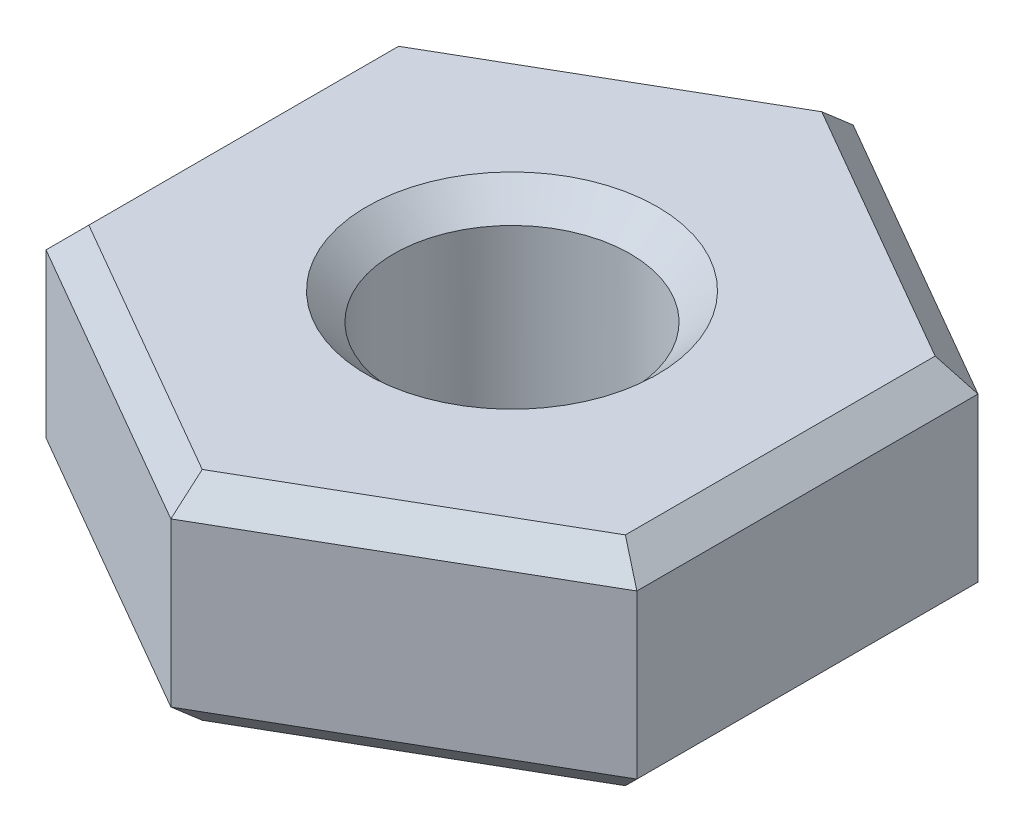
ISO-10303-21;
HEADER;
FILE_DESCRIPTION(('STEP AP214'),'2;1');
FILE_NAME('part.step','',(''),(''),'','','');
FILE_SCHEMA(('AUTOMOTIVE_DESIGN { 1 0 10303 214 1 1 1 1 }'));
ENDSEC;
DATA;
#1=APPLICATION_CONTEXT('core data for automotive mechanical design processes');
#2=APPLICATION_PROTOCOL_DEFINITION('international standard','automotive_design',2000,#1);
#3=PRODUCT_CONTEXT('',#1,'mechanical');
#4=PRODUCT('Part','Part','',(#3));
#5=PRODUCT_RELATED_PRODUCT_CATEGORY('part','',(#4));
#6=PRODUCT_DEFINITION_FORMATION('','',#4);
#7=PRODUCT_DEFINITION_CONTEXT('part definition',#1,'design');
#8=PRODUCT_DEFINITION('design','',#6,#7);
#9=PRODUCT_DEFINITION_SHAPE('','',#8);
#10=(LENGTH_UNIT() NAMED_UNIT(*) SI_UNIT(.MILLI.,.METRE.));
#11=(NAMED_UNIT(*) PLANE_ANGLE_UNIT() SI_UNIT($,.RADIAN.));
#12=(NAMED_UNIT(*) SI_UNIT($,.STERADIAN.) SOLID_ANGLE_UNIT());
#13=UNCERTAINTY_MEASURE_WITH_UNIT(LENGTH_MEASURE(1.E-05),#10,'distance_accuracy_value','');
#14=(GEOMETRIC_REPRESENTATION_CONTEXT(3) GLOBAL_UNCERTAINTY_ASSIGNED_CONTEXT((#13)) GLOBAL_UNIT_ASSIGNED_CONTEXT((#10,
#11,#12)) REPRESENTATION_CONTEXT('',''));
#15=CARTESIAN_POINT('',(0.,0.,0.));
#16=DIRECTION('',(0.,0.,1.));
#17=DIRECTION('',(1.,0.,0.));
#18=AXIS2_PLACEMENT_3D('',#15,#16,#17);
#19=CARTESIAN_POINT('',(4.318,3.175,-2.4929984623608));
#20=DIRECTION('',(-0.500000000000001,0.,0.866025403784438));
#21=DIRECTION('',(0.866025403784438,0.,0.500000000000001));
#22=AXIS2_PLACEMENT_3D('',#19,#20,#21);
#23=PLANE('',#22);
#24=DIRECTION('',(0.,-1.,0.));
#25=VECTOR('',#24,1.);
#26=CARTESIAN_POINT('',(4.318,3.175,-2.4929984623608));
#27=LINE('',#26,#25);
#28=CARTESIAN_POINT('',(4.318,2.778125,-2.4929984623608));
#29=VERTEX_POINT('',#28);
#30=CARTESIAN_POINT('',(4.318,0.396875000000002,-2.4929984623608));
#31=VERTEX_POINT('',#30);
#32=EDGE_CURVE('E110',#29,#31,#27,.T.);
#33=ORIENTED_EDGE('',*,*,#32,.T.);
#34=DIRECTION('',(-0.866025403784438,0.,-0.500000000000001));
#35=VECTOR('',#34,1.);
#36=CARTESIAN_POINT('',(0.,0.396875000000002,-4.98599692472161));
#37=LINE('',#36,#35);
#38=CARTESIAN_POINT('',(0.,0.396875000000001,-4.98599692472161));
#39=VERTEX_POINT('',#38);
#40=EDGE_CURVE('E117',#31,#39,#37,.T.);
#41=ORIENTED_EDGE('',*,*,#40,.T.);
#42=DIRECTION('',(0.,-1.,0.));
#43=VECTOR('',#42,1.);
#44=CARTESIAN_POINT('',(0.,3.175,-4.98599692472161));
#45=LINE('',#44,#43);
#46=CARTESIAN_POINT('',(0.,2.778125,-4.98599692472161));
#47=VERTEX_POINT('',#46);
#48=EDGE_CURVE('E112',#47,#39,#45,.T.);
#49=ORIENTED_EDGE('',*,*,#48,.F.);
#50=DIRECTION('',(0.866025403784438,0.,0.500000000000001));
#51=VECTOR('',#50,1.);
#52=CARTESIAN_POINT('',(4.318,2.778125,-2.4929984623608));
#53=LINE('',#52,#51);
#54=EDGE_CURVE('E108',#47,#29,#53,.T.);
#55=ORIENTED_EDGE('',*,*,#54,.T.);
#56=EDGE_LOOP('',(#33,#41,#49,#55));
#57=FACE_BOUND('',#56,.T.);
#58=ADVANCED_FACE('F14',(#57),#23,.F.);
#59=CARTESIAN_POINT('',(0.,3.175,-4.98599692472161));
#60=DIRECTION('',(0.499999999999999,0.,0.866025403784439));
#61=DIRECTION('',(0.866025403784439,0.,-0.499999999999999));
#62=AXIS2_PLACEMENT_3D('',#59,#60,#61);
#63=PLANE('',#62);
#64=ORIENTED_EDGE('',*,*,#48,.T.);
#65=DIRECTION('',(-0.866025403784439,0.,0.499999999999999));
#66=VECTOR('',#65,1.);
#67=CARTESIAN_POINT('',(-4.318,0.396875000000001,-2.49299846236081));
#68=LINE('',#67,#66);
#69=CARTESIAN_POINT('',(-4.318,0.396875000000001,-2.49299846236081));
#70=VERTEX_POINT('',#69);
#71=EDGE_CURVE('E164',#39,#70,#68,.T.);
#72=ORIENTED_EDGE('',*,*,#71,.T.);
#73=DIRECTION('',(0.,-1.,0.));
#74=VECTOR('',#73,1.);
#75=CARTESIAN_POINT('',(-4.318,3.175,-2.49299846236081));
#76=LINE('',#75,#74);
#77=CARTESIAN_POINT('',(-4.318,2.778125,-2.49299846236081));
#78=VERTEX_POINT('',#77);
#79=EDGE_CURVE('E146',#78,#70,#76,.T.);
#80=ORIENTED_EDGE('',*,*,#79,.F.);
#81=DIRECTION('',(0.866025403784439,0.,-0.499999999999999));
#82=VECTOR('',#81,1.);
#83=CARTESIAN_POINT('',(0.,2.778125,-4.98599692472161));
#84=LINE('',#83,#82);
#85=EDGE_CURVE('E162',#78,#47,#84,.T.);
#86=ORIENTED_EDGE('',*,*,#85,.T.);
#87=EDGE_LOOP('',(#64,#72,#80,#86));
#88=FACE_BOUND('',#87,.T.);
#89=ADVANCED_FACE('F224',(#88),#63,.F.);
#90=CARTESIAN_POINT('',(-4.318,3.175,-2.49299846236081));
#91=DIRECTION('',(1.,0.,0.));
#92=DIRECTION('',(0.,0.,-1.));
#93=AXIS2_PLACEMENT_3D('',#90,#91,#92);
#94=PLANE('',#93);
#95=ORIENTED_EDGE('',*,*,#79,.T.);
#96=DIRECTION('',(0.,0.,1.));
#97=VECTOR('',#96,1.);
#98=CARTESIAN_POINT('',(-4.318,0.396875000000001,2.4929984623608));
#99=LINE('',#98,#97);
#100=CARTESIAN_POINT('',(-4.318,0.396875000000001,2.4929984623608));
#101=VERTEX_POINT('',#100);
#102=EDGE_CURVE('E168',#70,#101,#99,.T.);
#103=ORIENTED_EDGE('',*,*,#102,.T.);
#104=DIRECTION('',(0.,-1.,0.));
#105=VECTOR('',#104,1.);
#106=CARTESIAN_POINT('',(-4.318,3.175,2.4929984623608));
#107=LINE('',#106,#105);
#108=CARTESIAN_POINT('',(-4.318,2.778125,2.4929984623608));
#109=VERTEX_POINT('',#108);
#110=EDGE_CURVE('E229',#109,#101,#107,.T.);
#111=ORIENTED_EDGE('',*,*,#110,.F.);
#112=DIRECTION('',(0.,0.,-1.));
#113=VECTOR('',#112,1.);
#114=CARTESIAN_POINT('',(-4.318,2.778125,-2.49299846236081));
#115=LINE('',#114,#113);
#116=EDGE_CURVE('E166',#109,#78,#115,.T.);
#117=ORIENTED_EDGE('',*,*,#116,.T.);
#118=EDGE_LOOP('',(#95,#103,#111,#117));
#119=FACE_BOUND('',#118,.T.);
#120=ADVANCED_FACE('F264',(#119),#94,.F.);
#121=CARTESIAN_POINT('',(-4.318,3.175,2.4929984623608));
#122=DIRECTION('',(0.5,0.,-0.866025403784438));
#123=DIRECTION('',(-0.866025403784438,0.,-0.5));
#124=AXIS2_PLACEMENT_3D('',#121,#122,#123);
#125=PLANE('',#124);
#126=ORIENTED_EDGE('',*,*,#110,.T.);
#127=DIRECTION('',(0.866025403784438,0.,0.5));
#128=VECTOR('',#127,1.);
#129=CARTESIAN_POINT('',(0.,0.396875000000001,4.98599692472161));
#130=LINE('',#129,#128);
#131=CARTESIAN_POINT('',(0.,0.396875000000002,4.98599692472161));
#132=VERTEX_POINT('',#131);
#133=EDGE_CURVE('E173',#101,#132,#130,.T.);
#134=ORIENTED_EDGE('',*,*,#133,.T.);
#135=DIRECTION('',(0.,-1.,0.));
#136=VECTOR('',#135,1.);
#137=CARTESIAN_POINT('',(0.,3.175,4.98599692472161));
#138=LINE('',#137,#136);
#139=CARTESIAN_POINT('',(0.,2.778125,4.98599692472161));
#140=VERTEX_POINT('',#139);
#141=EDGE_CURVE('E231',#140,#132,#138,.T.);
#142=ORIENTED_EDGE('',*,*,#141,.F.);
#143=DIRECTION('',(-0.866025403784438,0.,-0.5));
#144=VECTOR('',#143,1.);
#145=CARTESIAN_POINT('',(-4.318,2.778125,2.4929984623608));
#146=LINE('',#145,#144);
#147=EDGE_CURVE('E170',#140,#109,#146,.T.);
#148=ORIENTED_EDGE('',*,*,#147,.T.);
#149=EDGE_LOOP('',(#126,#134,#142,#148));
#150=FACE_BOUND('',#149,.T.);
#151=ADVANCED_FACE('F388',(#150),#125,.F.);
#152=CARTESIAN_POINT('',(0.,3.175,4.98599692472161));
#153=DIRECTION('',(-0.5,0.,-0.866025403784439));
#154=DIRECTION('',(-0.866025403784439,0.,0.5));
#155=AXIS2_PLACEMENT_3D('',#152,#153,#154);
#156=PLANE('',#155);
#157=ORIENTED_EDGE('',*,*,#141,.T.);
#158=DIRECTION('',(0.866025403784439,0.,-0.5));
#159=VECTOR('',#158,1.);
#160=CARTESIAN_POINT('',(4.318,0.396875000000002,2.49299846236081));
#161=LINE('',#160,#159);
#162=CARTESIAN_POINT('',(4.318,0.396875000000002,2.49299846236081));
#163=VERTEX_POINT('',#162);
#164=EDGE_CURVE('E177',#132,#163,#161,.T.);
#165=ORIENTED_EDGE('',*,*,#164,.T.);
#166=DIRECTION('',(0.,-1.,0.));
#167=VECTOR('',#166,1.);
#168=CARTESIAN_POINT('',(4.318,3.175,2.49299846236081));
#169=LINE('',#168,#167);
#170=CARTESIAN_POINT('',(4.318,2.778125,2.49299846236081));
#171=VERTEX_POINT('',#170);
#172=EDGE_CURVE('E129',#171,#163,#169,.T.);
#173=ORIENTED_EDGE('',*,*,#172,.F.);
#174=DIRECTION('',(-0.866025403784439,0.,0.5));
#175=VECTOR('',#174,1.);
#176=CARTESIAN_POINT('',(0.,2.778125,4.98599692472161));
#177=LINE('',#176,#175);
#178=EDGE_CURVE('E175',#171,#140,#177,.T.);
#179=ORIENTED_EDGE('',*,*,#178,.T.);
#180=EDGE_LOOP('',(#157,#165,#173,#179));
#181=FACE_BOUND('',#180,.T.);
#182=ADVANCED_FACE('F379',(#181),#156,.F.);
#183=CARTESIAN_POINT('',(4.318,3.175,2.49299846236081));
#184=DIRECTION('',(-1.,0.,0.));
#185=DIRECTION('',(0.,0.,1.));
#186=AXIS2_PLACEMENT_3D('',#183,#184,#185);
#187=PLANE('',#186);
#188=ORIENTED_EDGE('',*,*,#172,.T.);
#189=DIRECTION('',(0.,0.,-1.));
#190=VECTOR('',#189,1.);
#191=CARTESIAN_POINT('',(4.318,0.396875000000001,-2.4929984623608));
#192=LINE('',#191,#190);
#193=EDGE_CURVE('E128',#163,#31,#192,.T.);
#194=ORIENTED_EDGE('',*,*,#193,.T.);
#195=ORIENTED_EDGE('',*,*,#32,.F.);
#196=DIRECTION('',(0.,0.,1.));
#197=VECTOR('',#196,1.);
#198=CARTESIAN_POINT('',(4.318,2.778125,2.49299846236081));
#199=LINE('',#198,#197);
#200=EDGE_CURVE('E125',#29,#171,#199,.T.);
#201=ORIENTED_EDGE('',*,*,#200,.T.);
#202=EDGE_LOOP('',(#188,#194,#195,#201));
#203=FACE_BOUND('',#202,.T.);
#204=ADVANCED_FACE('F123',(#203),#187,.F.);
#205=CARTESIAN_POINT('',(8.636,3.175,0.));
#206=DIRECTION('',(0.,-1.,0.));
#207=DIRECTION('',(0.,0.,-1.));
#208=AXIS2_PLACEMENT_3D('',#205,#206,#207);
#209=PLANE('',#208);
#210=CARTESIAN_POINT('',(0.,3.175,0.));
#211=DIRECTION('',(0.,-1.,0.));
#212=DIRECTION('',(0.,0.,-1.));
#213=AXIS2_PLACEMENT_3D('',#210,#211,#212);
#214=CIRCLE('',#213,2.12407499999999);
#215=CARTESIAN_POINT('',(0.,3.175,-2.12407499999999));
#216=VERTEX_POINT('',#215);
#217=EDGE_CURVE('E9',#216,#216,#214,.T.);
#218=ORIENTED_EDGE('',*,*,#217,.T.);
#219=EDGE_LOOP('',(#218));
#220=FACE_BOUND('',#219,.T.);
#221=DIRECTION('',(0.,0.,1.));
#222=VECTOR('',#221,1.);
#223=CARTESIAN_POINT('',(-3.921125,3.175,0.));
#224=LINE('',#223,#222);
#225=CARTESIAN_POINT('',(-3.921125,3.175,-2.26386257427618));
#226=VERTEX_POINT('',#225);
#227=CARTESIAN_POINT('',(-3.921125,3.175,2.26386257427617));
#228=VERTEX_POINT('',#227);
#229=EDGE_CURVE('E182',#226,#228,#224,.T.);
#230=ORIENTED_EDGE('',*,*,#229,.T.);
#231=DIRECTION('',(0.866025403784438,0.,0.5));
#232=VECTOR('',#231,1.);
#233=CARTESIAN_POINT('',(4.5164375,3.175,7.13529155495547));
#234=LINE('',#233,#232);
#235=CARTESIAN_POINT('',(0.,3.175,4.52772514855234));
#236=VERTEX_POINT('',#235);
#237=EDGE_CURVE('E23',#228,#236,#234,.T.);
#238=ORIENTED_EDGE('',*,*,#237,.T.);
#239=DIRECTION('',(0.866025403784439,0.,-0.5));
#240=VECTOR('',#239,1.);
#241=CARTESIAN_POINT('',(8.4375625,3.175,-0.343703832126945));
#242=LINE('',#241,#240);
#243=CARTESIAN_POINT('',(3.921125,3.175,2.26386257427618));
#244=VERTEX_POINT('',#243);
#245=EDGE_CURVE('E38',#236,#244,#242,.T.);
#246=ORIENTED_EDGE('',*,*,#245,.T.);
#247=DIRECTION('',(0.,0.,-1.));
#248=VECTOR('',#247,1.);
#249=CARTESIAN_POINT('',(3.921125,3.175,0.));
#250=LINE('',#249,#248);
#251=CARTESIAN_POINT('',(3.921125,3.175,-2.26386257427617));
#252=VERTEX_POINT('',#251);
#253=EDGE_CURVE('E187',#244,#252,#250,.T.);
#254=ORIENTED_EDGE('',*,*,#253,.T.);
#255=DIRECTION('',(-0.866025403784438,0.,-0.500000000000001));
#256=VECTOR('',#255,1.);
#257=CARTESIAN_POINT('',(8.4375625,3.175,0.343703832126955));
#258=LINE('',#257,#256);
#259=CARTESIAN_POINT('',(0.,3.175,-4.52772514855234));
#260=VERTEX_POINT('',#259);
#261=EDGE_CURVE('E135',#252,#260,#258,.T.);
#262=ORIENTED_EDGE('',*,*,#261,.T.);
#263=DIRECTION('',(-0.866025403784439,0.,0.499999999999999));
#264=VECTOR('',#263,1.);
#265=CARTESIAN_POINT('',(4.51643750000001,3.175,-7.13529155495546));
#266=LINE('',#265,#264);
#267=EDGE_CURVE('E184',#260,#226,#266,.T.);
#268=ORIENTED_EDGE('',*,*,#267,.T.);
#269=EDGE_LOOP('',(#230,#238,#246,#254,#262,#268));
#270=FACE_BOUND('',#269,.T.);
#271=ADVANCED_FACE('F255',(#220,#270),#209,.F.);
#272=CARTESIAN_POINT('',(8.636,0.,0.));
#273=DIRECTION('',(0.,-1.,0.));
#274=DIRECTION('',(0.,0.,-1.));
#275=AXIS2_PLACEMENT_3D('',#272,#273,#274);
#276=PLANE('',#275);
#277=DIRECTION('',(0.866025403784438,0.,0.500000000000001));
#278=VECTOR('',#277,1.);
#279=CARTESIAN_POINT('',(4.1195625,0.,-2.14929463023385));
#280=LINE('',#279,#278);
#281=CARTESIAN_POINT('',(0.,0.,-4.52772514855234));
#282=VERTEX_POINT('',#281);
#283=CARTESIAN_POINT('',(3.921125,0.,-2.26386257427617));
#284=VERTEX_POINT('',#283);
#285=EDGE_CURVE('E157',#282,#284,#280,.T.);
#286=ORIENTED_EDGE('',*,*,#285,.T.);
#287=DIRECTION('',(0.,0.,1.));
#288=VECTOR('',#287,1.);
#289=CARTESIAN_POINT('',(3.921125,0.,2.49299846236081));
#290=LINE('',#289,#288);
#291=CARTESIAN_POINT('',(3.921125,0.,2.26386257427617));
#292=VERTEX_POINT('',#291);
#293=EDGE_CURVE('E118',#284,#292,#290,.T.);
#294=ORIENTED_EDGE('',*,*,#293,.T.);
#295=DIRECTION('',(-0.866025403784439,0.,0.5));
#296=VECTOR('',#295,1.);
#297=CARTESIAN_POINT('',(-0.198437500000001,0.,4.64229309259466));
#298=LINE('',#297,#296);
#299=CARTESIAN_POINT('',(0.,0.,4.52772514855234));
#300=VERTEX_POINT('',#299);
#301=EDGE_CURVE('E144',#292,#300,#298,.T.);
#302=ORIENTED_EDGE('',*,*,#301,.T.);
#303=DIRECTION('',(-0.866025403784438,0.,-0.5));
#304=VECTOR('',#303,1.);
#305=CARTESIAN_POINT('',(-4.1195625,0.,2.14929463023385));
#306=LINE('',#305,#304);
#307=CARTESIAN_POINT('',(-3.921125,0.,2.26386257427617));
#308=VERTEX_POINT('',#307);
#309=EDGE_CURVE('E151',#300,#308,#306,.T.);
#310=ORIENTED_EDGE('',*,*,#309,.T.);
#311=DIRECTION('',(0.,0.,-1.));
#312=VECTOR('',#311,1.);
#313=CARTESIAN_POINT('',(-3.921125,0.,-2.49299846236081));
#314=LINE('',#313,#312);
#315=CARTESIAN_POINT('',(-3.921125,0.,-2.26386257427618));
#316=VERTEX_POINT('',#315);
#317=EDGE_CURVE('E153',#308,#316,#314,.T.);
#318=ORIENTED_EDGE('',*,*,#317,.T.);
#319=DIRECTION('',(0.866025403784439,0.,-0.499999999999999));
#320=VECTOR('',#319,1.);
#321=CARTESIAN_POINT('',(0.198437500000003,0.,-4.64229309259466));
#322=LINE('',#321,#320);
#323=EDGE_CURVE('E155',#316,#282,#322,.T.);
#324=ORIENTED_EDGE('',*,*,#323,.T.);
#325=EDGE_LOOP('',(#286,#294,#302,#310,#318,#324));
#326=FACE_BOUND('',#325,.T.);
#327=CARTESIAN_POINT('',(0.,0.,0.));
#328=DIRECTION('',(0.,1.,0.));
#329=DIRECTION('',(0.,0.,1.));
#330=AXIS2_PLACEMENT_3D('',#327,#328,#329);
#331=CIRCLE('',#330,1.7272);
#332=CARTESIAN_POINT('',(0.,0.,1.7272));
#333=VERTEX_POINT('',#332);
#334=EDGE_CURVE('E130',#333,#333,#331,.T.);
#335=ORIENTED_EDGE('',*,*,#334,.T.);
#336=EDGE_LOOP('',(#335));
#337=FACE_BOUND('',#336,.T.);
#338=ADVANCED_FACE('F240',(#326,#337),#276,.T.);
#339=CARTESIAN_POINT('',(0.,3.175,0.));
#340=DIRECTION('',(0.,1.,0.));
#341=DIRECTION('',(0.,0.,1.));
#342=AXIS2_PLACEMENT_3D('',#339,#340,#341);
#343=CYLINDRICAL_SURFACE('',#342,1.72719999999999);
#344=CARTESIAN_POINT('',(0.,2.77812500000001,0.));
#345=DIRECTION('',(0.,-1.,0.));
#346=DIRECTION('',(0.,0.,-1.));
#347=AXIS2_PLACEMENT_3D('',#344,#345,#346);
#348=CIRCLE('',#347,1.72719999999999);
#349=CARTESIAN_POINT('',(0.,2.77812500000001,-1.72719999999999));
#350=VERTEX_POINT('',#349);
#351=EDGE_CURVE('E179',#350,#350,#348,.F.);
#352=ORIENTED_EDGE('',*,*,#351,.T.);
#353=EDGE_LOOP('',(#352));
#354=FACE_BOUND('',#353,.T.);
#355=ORIENTED_EDGE('',*,*,#334,.F.);
#356=EDGE_LOOP('',(#355));
#357=FACE_BOUND('',#356,.T.);
#358=ADVANCED_FACE('F242',(#354,#357),#343,.F.);
#359=CARTESIAN_POINT('',(-4.318,0.396875000000001,-2.49299846236081));
#360=DIRECTION('',(-0.707106781186547,-0.707106781186548,0.));
#361=DIRECTION('',(0.,0.,-1.));
#362=AXIS2_PLACEMENT_3D('',#359,#360,#361);
#363=PLANE('',#362);
#364=DIRECTION('',(0.654653670707978,-0.654653670707977,0.377964473009225));
#365=VECTOR('',#364,1.);
#366=CARTESIAN_POINT('',(-4.318,0.396875000000001,-2.49299846236081));
#367=LINE('',#366,#365);
#368=EDGE_CURVE('E201',#316,#70,#367,.F.);
#369=ORIENTED_EDGE('',*,*,#368,.F.);
#370=ORIENTED_EDGE('',*,*,#317,.F.);
#371=DIRECTION('',(0.654653670707977,-0.654653670707976,-0.377964473009229));
#372=VECTOR('',#371,1.);
#373=CARTESIAN_POINT('',(-4.318,0.396875000000001,2.4929984623608));
#374=LINE('',#373,#372);
#375=EDGE_CURVE('E204',#101,#308,#374,.T.);
#376=ORIENTED_EDGE('',*,*,#375,.F.);
#377=ORIENTED_EDGE('',*,*,#102,.F.);
#378=EDGE_LOOP('',(#369,#370,#376,#377));
#379=FACE_BOUND('',#378,.T.);
#380=ADVANCED_FACE('F244',(#379),#363,.T.);
#381=CARTESIAN_POINT('',(-4.318,0.396875000000001,2.4929984623608));
#382=DIRECTION('',(-0.353553390593273,-0.707106781186549,0.612372435695793));
#383=DIRECTION('',(-0.866025403784438,0.,-0.5));
#384=AXIS2_PLACEMENT_3D('',#381,#382,#383);
#385=PLANE('',#384);
#386=ORIENTED_EDGE('',*,*,#375,.T.);
#387=ORIENTED_EDGE('',*,*,#309,.F.);
#388=DIRECTION('',(0.,-0.654653670707975,-0.755928946018456));
#389=VECTOR('',#388,1.);
#390=CARTESIAN_POINT('',(0.,0.396875000000001,4.98599692472161));
#391=LINE('',#390,#389);
#392=EDGE_CURVE('E198',#132,#300,#391,.T.);
#393=ORIENTED_EDGE('',*,*,#392,.F.);
#394=ORIENTED_EDGE('',*,*,#133,.F.);
#395=EDGE_LOOP('',(#386,#387,#393,#394));
#396=FACE_BOUND('',#395,.T.);
#397=ADVANCED_FACE('F252',(#396),#385,.T.);
#398=CARTESIAN_POINT('',(0.,0.396875000000001,-4.98599692472161));
#399=DIRECTION('',(-0.353553390593274,-0.707106781186547,-0.612372435695796));
#400=DIRECTION('',(0.866025403784439,0.,-0.499999999999999));
#401=AXIS2_PLACEMENT_3D('',#398,#399,#400);
#402=PLANE('',#401);
#403=ORIENTED_EDGE('',*,*,#368,.T.);
#404=ORIENTED_EDGE('',*,*,#71,.F.);
#405=DIRECTION('',(0.,-0.654653670707977,0.755928946018454));
#406=VECTOR('',#405,1.);
#407=CARTESIAN_POINT('',(0.,0.396875000000001,-4.98599692472161));
#408=LINE('',#407,#406);
#409=EDGE_CURVE('E195',#282,#39,#408,.F.);
#410=ORIENTED_EDGE('',*,*,#409,.F.);
#411=ORIENTED_EDGE('',*,*,#323,.F.);
#412=EDGE_LOOP('',(#403,#404,#410,#411));
#413=FACE_BOUND('',#412,.T.);
#414=ADVANCED_FACE('F280',(#413),#402,.T.);
#415=CARTESIAN_POINT('',(0.,0.396875000000001,4.98599692472161));
#416=DIRECTION('',(0.353553390593272,-0.70710678118655,0.612372435695793));
#417=DIRECTION('',(-0.866025403784439,0.,0.5));
#418=AXIS2_PLACEMENT_3D('',#415,#416,#417);
#419=PLANE('',#418);
#420=ORIENTED_EDGE('',*,*,#392,.T.);
#421=ORIENTED_EDGE('',*,*,#301,.F.);
#422=DIRECTION('',(0.654653670707977,0.654653670707975,0.37796447300923));
#423=VECTOR('',#422,1.);
#424=CARTESIAN_POINT('',(3.08428571428572,-0.836839285714276,1.78071318740058));
#425=LINE('',#424,#423);
#426=EDGE_CURVE('E193',#163,#292,#425,.F.);
#427=ORIENTED_EDGE('',*,*,#426,.F.);
#428=ORIENTED_EDGE('',*,*,#164,.F.);
#429=EDGE_LOOP('',(#420,#421,#427,#428));
#430=FACE_BOUND('',#429,.T.);
#431=ADVANCED_FACE('F276',(#430),#419,.T.);
#432=CARTESIAN_POINT('',(4.318,0.396875000000001,-2.4929984623608));
#433=DIRECTION('',(0.353553390593274,-0.707106781186549,-0.612372435695793));
#434=DIRECTION('',(0.866025403784438,0.,0.500000000000001));
#435=AXIS2_PLACEMENT_3D('',#432,#433,#434);
#436=PLANE('',#435);
#437=ORIENTED_EDGE('',*,*,#409,.T.);
#438=ORIENTED_EDGE('',*,*,#40,.F.);
#439=DIRECTION('',(-0.654653670707978,-0.654653670707976,0.377964473009227));
#440=VECTOR('',#439,1.);
#441=CARTESIAN_POINT('',(4.318,0.396875000000001,-2.4929984623608));
#442=LINE('',#441,#440);
#443=EDGE_CURVE('E191',#284,#31,#442,.F.);
#444=ORIENTED_EDGE('',*,*,#443,.F.);
#445=ORIENTED_EDGE('',*,*,#285,.F.);
#446=EDGE_LOOP('',(#437,#438,#444,#445));
#447=FACE_BOUND('',#446,.T.);
#448=ADVANCED_FACE('F272',(#447),#436,.T.);
#449=CARTESIAN_POINT('',(4.318,0.396875000000001,2.49299846236081));
#450=DIRECTION('',(0.707106781186546,-0.707106781186549,0.));
#451=DIRECTION('',(0.,0.,1.));
#452=AXIS2_PLACEMENT_3D('',#449,#450,#451);
#453=PLANE('',#452);
#454=ORIENTED_EDGE('',*,*,#426,.T.);
#455=ORIENTED_EDGE('',*,*,#293,.F.);
#456=ORIENTED_EDGE('',*,*,#443,.T.);
#457=ORIENTED_EDGE('',*,*,#193,.F.);
#458=EDGE_LOOP('',(#454,#455,#456,#457));
#459=FACE_BOUND('',#458,.T.);
#460=ADVANCED_FACE('F268',(#459),#453,.T.);
#461=CARTESIAN_POINT('',(0.,2.77812500000001,0.));
#462=DIRECTION('',(0.,1.,0.));
#463=DIRECTION('',(0.,0.,1.));
#464=AXIS2_PLACEMENT_3D('',#461,#462,#463);
#465=CONICAL_SURFACE('',#464,1.72719999999999,0.785398163397448);
#466=ORIENTED_EDGE('',*,*,#217,.F.);
#467=EDGE_LOOP('',(#466));
#468=FACE_BOUND('',#467,.T.);
#469=ORIENTED_EDGE('',*,*,#351,.F.);
#470=EDGE_LOOP('',(#469));
#471=FACE_BOUND('',#470,.T.);
#472=ADVANCED_FACE('F271',(#468,#471),#465,.F.);
#473=CARTESIAN_POINT('',(8.4375625,3.175,0.343703832126955));
#474=DIRECTION('',(-0.353553390593275,-0.707106781186546,0.612372435695796));
#475=DIRECTION('',(-0.866025403784438,0.,-0.500000000000001));
#476=AXIS2_PLACEMENT_3D('',#473,#474,#475);
#477=PLANE('',#476);
#478=DIRECTION('',(0.654653670707976,-0.654653670707979,-0.377964473009227));
#479=VECTOR('',#478,1.);
#480=CARTESIAN_POINT('',(5.21153571428571,1.88458928571429,-3.0088815475342));
#481=LINE('',#480,#479);
#482=EDGE_CURVE('E134',#29,#252,#481,.F.);
#483=ORIENTED_EDGE('',*,*,#482,.F.);
#484=ORIENTED_EDGE('',*,*,#54,.F.);
#485=DIRECTION('',(0.,-0.654653670707979,-0.755928946018453));
#486=VECTOR('',#485,1.);
#487=CARTESIAN_POINT('',(0.,1.88458928571428,-6.01776309506841));
#488=LINE('',#487,#486);
#489=EDGE_CURVE('E18',#260,#47,#488,.T.);
#490=ORIENTED_EDGE('',*,*,#489,.F.);
#491=ORIENTED_EDGE('',*,*,#261,.F.);
#492=EDGE_LOOP('',(#483,#484,#490,#491));
#493=FACE_BOUND('',#492,.T.);
#494=ADVANCED_FACE('F16',(#493),#477,.F.);
#495=CARTESIAN_POINT('',(4.51643750000001,3.175,-7.13529155495546));
#496=DIRECTION('',(0.353553390593274,-0.707106781186546,0.612372435695796));
#497=DIRECTION('',(-0.866025403784439,0.,0.499999999999999));
#498=AXIS2_PLACEMENT_3D('',#495,#496,#497);
#499=PLANE('',#498);
#500=ORIENTED_EDGE('',*,*,#489,.T.);
#501=ORIENTED_EDGE('',*,*,#85,.F.);
#502=DIRECTION('',(-0.654653670707976,-0.654653670707979,-0.377964473009226));
#503=VECTOR('',#502,1.);
#504=CARTESIAN_POINT('',(-3.36096428571428,3.73516071428571,-1.94045363509387));
#505=LINE('',#504,#503);
#506=EDGE_CURVE('E137',#226,#78,#505,.T.);
#507=ORIENTED_EDGE('',*,*,#506,.F.);
#508=ORIENTED_EDGE('',*,*,#267,.F.);
#509=EDGE_LOOP('',(#500,#501,#507,#508));
#510=FACE_BOUND('',#509,.T.);
#511=ADVANCED_FACE('F221',(#510),#499,.F.);
#512=CARTESIAN_POINT('',(3.921125,3.175,0.));
#513=DIRECTION('',(-0.707106781186549,-0.707106781186546,0.));
#514=DIRECTION('',(0.,0.,-1.));
#515=AXIS2_PLACEMENT_3D('',#512,#513,#514);
#516=PLANE('',#515);
#517=ORIENTED_EDGE('',*,*,#482,.T.);
#518=ORIENTED_EDGE('',*,*,#253,.F.);
#519=DIRECTION('',(0.654653670707975,-0.654653670707979,0.377964473009229));
#520=VECTOR('',#519,1.);
#521=CARTESIAN_POINT('',(3.36096428571428,3.73516071428572,1.94045363509386));
#522=LINE('',#521,#520);
#523=EDGE_CURVE('E141',#171,#244,#522,.F.);
#524=ORIENTED_EDGE('',*,*,#523,.F.);
#525=ORIENTED_EDGE('',*,*,#200,.F.);
#526=EDGE_LOOP('',(#517,#518,#524,#525));
#527=FACE_BOUND('',#526,.T.);
#528=ADVANCED_FACE('F139',(#527),#516,.F.);
#529=CARTESIAN_POINT('',(-3.921125,3.175,0.));
#530=DIRECTION('',(0.707106781186549,-0.707106781186546,0.));
#531=DIRECTION('',(0.,0.,1.));
#532=AXIS2_PLACEMENT_3D('',#529,#530,#531);
#533=PLANE('',#532);
#534=ORIENTED_EDGE('',*,*,#506,.T.);
#535=ORIENTED_EDGE('',*,*,#116,.F.);
#536=DIRECTION('',(0.654653670707976,0.654653670707978,-0.377964473009228));
#537=VECTOR('',#536,1.);
#538=CARTESIAN_POINT('',(-3.36096428571428,3.73516071428572,1.94045363509386));
#539=LINE('',#538,#537);
#540=EDGE_CURVE('E208',#228,#109,#539,.F.);
#541=ORIENTED_EDGE('',*,*,#540,.F.);
#542=ORIENTED_EDGE('',*,*,#229,.F.);
#543=EDGE_LOOP('',(#534,#535,#541,#542));
#544=FACE_BOUND('',#543,.T.);
#545=ADVANCED_FACE('F216',(#544),#533,.F.);
#546=CARTESIAN_POINT('',(8.4375625,3.175,-0.343703832126944));
#547=DIRECTION('',(-0.353553390593274,-0.707106781186547,-0.612372435695795));
#548=DIRECTION('',(0.866025403784439,0.,-0.5));
#549=AXIS2_PLACEMENT_3D('',#546,#547,#548);
#550=PLANE('',#549);
#551=ORIENTED_EDGE('',*,*,#523,.T.);
#552=ORIENTED_EDGE('',*,*,#245,.F.);
#553=DIRECTION('',(0.,-0.654653670707978,0.755928946018454));
#554=VECTOR('',#553,1.);
#555=CARTESIAN_POINT('',(0.,5.58573214285715,1.74405144530703));
#556=LINE('',#555,#554);
#557=EDGE_CURVE('E31',#140,#236,#556,.F.);
#558=ORIENTED_EDGE('',*,*,#557,.F.);
#559=ORIENTED_EDGE('',*,*,#178,.F.);
#560=EDGE_LOOP('',(#551,#552,#558,#559));
#561=FACE_BOUND('',#560,.T.);
#562=ADVANCED_FACE('F294',(#561),#550,.F.);
#563=CARTESIAN_POINT('',(4.5164375,3.175,7.13529155495547));
#564=DIRECTION('',(0.353553390593274,-0.707106781186547,-0.612372435695794));
#565=DIRECTION('',(0.866025403784438,0.,0.5));
#566=AXIS2_PLACEMENT_3D('',#563,#564,#565);
#567=PLANE('',#566);
#568=ORIENTED_EDGE('',*,*,#540,.T.);
#569=ORIENTED_EDGE('',*,*,#147,.F.);
#570=ORIENTED_EDGE('',*,*,#557,.T.);
#571=ORIENTED_EDGE('',*,*,#237,.F.);
#572=EDGE_LOOP('',(#568,#569,#570,#571));
#573=FACE_BOUND('',#572,.T.);
#574=ADVANCED_FACE('F291',(#573),#567,.F.);
#575=CLOSED_SHELL('',(#58,#89,#120,#151,#182,#204,#271,#338,#358,#380,#397,#414,#431,#448,#460,
#472,#494,#511,#528,#545,#562,#574));
#576=MANIFOLD_SOLID_BREP('B1',#575);
#577=ADVANCED_BREP_SHAPE_REPRESENTATION('',(#18,#576),#14);
#578=SHAPE_DEFINITION_REPRESENTATION(#9,#577);
ENDSEC;
END-ISO-10303-21;
